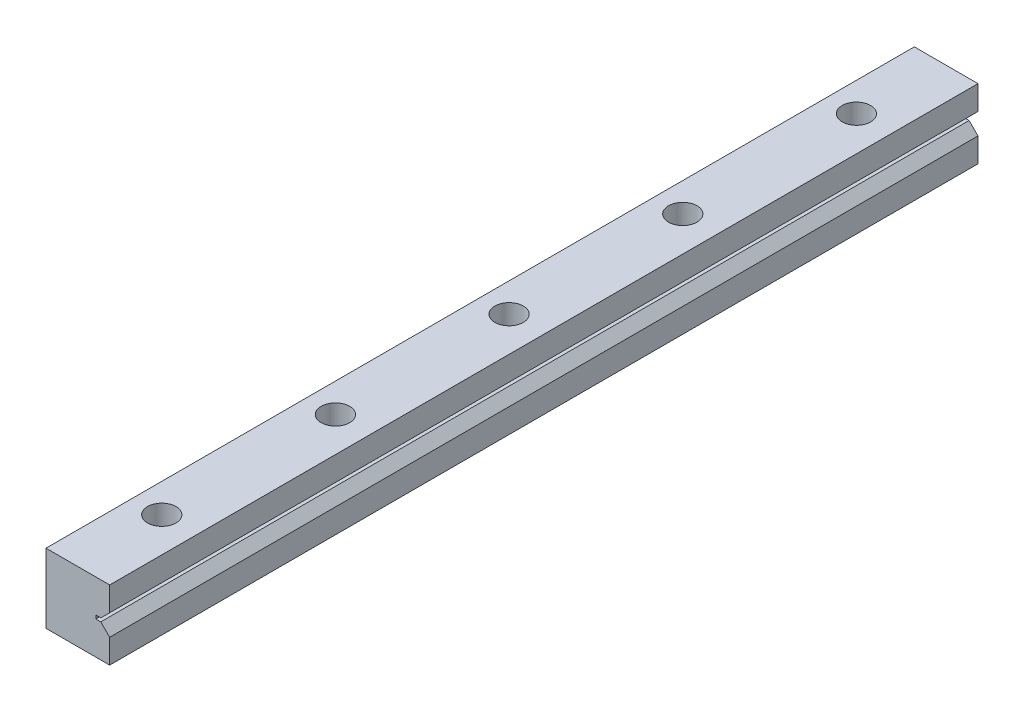
ISO-10303-21;
HEADER;
FILE_DESCRIPTION(('STEP AP214'),'2;1');
FILE_NAME('part.step','',(''),(''),'','','');
FILE_SCHEMA(('AUTOMOTIVE_DESIGN { 1 0 10303 214 1 1 1 1 }'));
ENDSEC;
DATA;
#1=APPLICATION_CONTEXT('core data for automotive mechanical design processes');
#2=APPLICATION_PROTOCOL_DEFINITION('international standard','automotive_design',2000,#1);
#3=PRODUCT_CONTEXT('',#1,'mechanical');
#4=PRODUCT('Part','Part','',(#3));
#5=PRODUCT_RELATED_PRODUCT_CATEGORY('part','',(#4));
#6=PRODUCT_DEFINITION_FORMATION('','',#4);
#7=PRODUCT_DEFINITION_CONTEXT('part definition',#1,'design');
#8=PRODUCT_DEFINITION('design','',#6,#7);
#9=PRODUCT_DEFINITION_SHAPE('','',#8);
#10=(LENGTH_UNIT() NAMED_UNIT(*) SI_UNIT(.MILLI.,.METRE.));
#11=(NAMED_UNIT(*) PLANE_ANGLE_UNIT() SI_UNIT($,.RADIAN.));
#12=(NAMED_UNIT(*) SI_UNIT($,.STERADIAN.) SOLID_ANGLE_UNIT());
#13=UNCERTAINTY_MEASURE_WITH_UNIT(LENGTH_MEASURE(1.E-05),#10,'distance_accuracy_value','');
#14=(GEOMETRIC_REPRESENTATION_CONTEXT(3) GLOBAL_UNCERTAINTY_ASSIGNED_CONTEXT((#13)) GLOBAL_UNIT_ASSIGNED_CONTEXT((#10,
#11,#12)) REPRESENTATION_CONTEXT('',''));
#15=CARTESIAN_POINT('',(0.,0.,0.));
#16=DIRECTION('',(0.,0.,1.));
#17=DIRECTION('',(1.,0.,0.));
#18=AXIS2_PLACEMENT_3D('',#15,#16,#17);
#19=CARTESIAN_POINT('',(-1.70000000000001,0.154630465789199,0.));
#20=DIRECTION('',(0.,1.,0.));
#21=DIRECTION('',(0.,0.,1.));
#22=AXIS2_PLACEMENT_3D('',#19,#20,#21);
#23=PLANE('',#22);
#24=DIRECTION('',(1.,0.,0.));
#25=VECTOR('',#24,1.);
#26=CARTESIAN_POINT('',(-1.70000000000001,0.154630465789199,75.));
#27=LINE('',#26,#25);
#28=CARTESIAN_POINT('',(-1.70000000000001,0.154630465789199,75.));
#29=VERTEX_POINT('',#28);
#30=CARTESIAN_POINT('',(-1.25958309658391,0.154630465789196,75.));
#31=VERTEX_POINT('',#30);
#32=EDGE_CURVE('E106',#29,#31,#27,.T.);
#33=ORIENTED_EDGE('',*,*,#32,.F.);
#34=DIRECTION('',(0.,0.,1.));
#35=VECTOR('',#34,1.);
#36=CARTESIAN_POINT('',(-1.70000000000001,0.154630465789199,0.));
#37=LINE('',#36,#35);
#38=CARTESIAN_POINT('',(-1.70000000000001,0.154630465789199,0.));
#39=VERTEX_POINT('',#38);
#40=EDGE_CURVE('E110',#29,#39,#37,.F.);
#41=ORIENTED_EDGE('',*,*,#40,.T.);
#42=DIRECTION('',(1.,0.,0.));
#43=VECTOR('',#42,1.);
#44=CARTESIAN_POINT('',(-1.70000000000001,0.154630465789199,0.));
#45=LINE('',#44,#43);
#46=CARTESIAN_POINT('',(-1.25958309658391,0.154630465789196,0.));
#47=VERTEX_POINT('',#46);
#48=EDGE_CURVE('E115',#47,#39,#45,.F.);
#49=ORIENTED_EDGE('',*,*,#48,.F.);
#50=DIRECTION('',(0.,0.,1.));
#51=VECTOR('',#50,1.);
#52=CARTESIAN_POINT('',(-1.2595830965839,0.154630465789186,0.));
#53=LINE('',#52,#51);
#54=EDGE_CURVE('E113',#47,#31,#53,.T.);
#55=ORIENTED_EDGE('',*,*,#54,.T.);
#56=EDGE_LOOP('',(#33,#41,#49,#55));
#57=FACE_BOUND('',#56,.T.);
#58=ADVANCED_FACE('F17',(#57),#23,.F.);
#59=CARTESIAN_POINT('',(-1.70000000000001,-0.14536953421082,0.));
#60=DIRECTION('',(-1.,0.,0.));
#61=DIRECTION('',(0.,0.,1.));
#62=AXIS2_PLACEMENT_3D('',#59,#60,#61);
#63=PLANE('',#62);
#64=DIRECTION('',(0.,0.,-1.));
#65=VECTOR('',#64,1.);
#66=CARTESIAN_POINT('',(-1.70000000000001,-0.145369534210795,0.));
#67=LINE('',#66,#65);
#68=CARTESIAN_POINT('',(-1.70000000000001,-0.145369534210814,75.));
#69=VERTEX_POINT('',#68);
#70=CARTESIAN_POINT('',(-1.70000000000001,-0.145369534210814,0.));
#71=VERTEX_POINT('',#70);
#72=EDGE_CURVE('E138',#69,#71,#67,.T.);
#73=ORIENTED_EDGE('',*,*,#72,.T.);
#74=DIRECTION('',(0.,1.,0.));
#75=VECTOR('',#74,1.);
#76=CARTESIAN_POINT('',(-1.70000000000001,-0.14536953421082,0.));
#77=LINE('',#76,#75);
#78=EDGE_CURVE('E125',#39,#71,#77,.F.);
#79=ORIENTED_EDGE('',*,*,#78,.F.);
#80=ORIENTED_EDGE('',*,*,#40,.F.);
#81=DIRECTION('',(0.,1.,0.));
#82=VECTOR('',#81,1.);
#83=CARTESIAN_POINT('',(-1.70000000000001,-0.14536953421082,75.));
#84=LINE('',#83,#82);
#85=EDGE_CURVE('E118',#69,#29,#84,.T.);
#86=ORIENTED_EDGE('',*,*,#85,.F.);
#87=EDGE_LOOP('',(#73,#79,#80,#86));
#88=FACE_BOUND('',#87,.T.);
#89=ADVANCED_FACE('F127',(#88),#63,.F.);
#90=CARTESIAN_POINT('',(-1.41421356237309,0.,0.));
#91=DIRECTION('',(-0.707106781186547,0.707106781186548,0.));
#92=DIRECTION('',(-0.707106781186548,-0.707106781186547,0.));
#93=AXIS2_PLACEMENT_3D('',#90,#91,#92);
#94=PLANE('',#93);
#95=DIRECTION('',(-0.707106781186548,-0.707106781186547,0.));
#96=VECTOR('',#95,1.);
#97=CARTESIAN_POINT('',(-1.41421356237309,0.,75.));
#98=LINE('',#97,#96);
#99=CARTESIAN_POINT('',(-0.5,0.914213562373098,75.));
#100=VERTEX_POINT('',#99);
#101=EDGE_CURVE('E131',#31,#100,#98,.F.);
#102=ORIENTED_EDGE('',*,*,#101,.F.);
#103=ORIENTED_EDGE('',*,*,#54,.F.);
#104=DIRECTION('',(-0.707106781186548,-0.707106781186547,0.));
#105=VECTOR('',#104,1.);
#106=CARTESIAN_POINT('',(-1.41421356237309,0.,0.));
#107=LINE('',#106,#105);
#108=CARTESIAN_POINT('',(-0.5,0.914213562373098,0.));
#109=VERTEX_POINT('',#108);
#110=EDGE_CURVE('E124',#109,#47,#107,.T.);
#111=ORIENTED_EDGE('',*,*,#110,.F.);
#112=DIRECTION('',(0.,0.,-1.));
#113=VECTOR('',#112,1.);
#114=CARTESIAN_POINT('',(-0.500000000000007,0.914213562373105,0.));
#115=LINE('',#114,#113);
#116=EDGE_CURVE('E137',#100,#109,#115,.T.);
#117=ORIENTED_EDGE('',*,*,#116,.F.);
#118=EDGE_LOOP('',(#102,#103,#111,#117));
#119=FACE_BOUND('',#118,.T.);
#120=ADVANCED_FACE('F472',(#119),#94,.F.);
#121=CARTESIAN_POINT('',(-0.500000000000007,-0.145369534210795,0.));
#122=DIRECTION('',(0.,-1.,0.));
#123=DIRECTION('',(0.,0.,-1.));
#124=AXIS2_PLACEMENT_3D('',#121,#122,#123);
#125=PLANE('',#124);
#126=DIRECTION('',(1.,0.,0.));
#127=VECTOR('',#126,1.);
#128=CARTESIAN_POINT('',(-0.500000000000007,-0.145369534210795,0.));
#129=LINE('',#128,#127);
#130=CARTESIAN_POINT('',(-1.26884402816229,-0.145369534210804,0.));
#131=VERTEX_POINT('',#130);
#132=EDGE_CURVE('E135',#71,#131,#129,.T.);
#133=ORIENTED_EDGE('',*,*,#132,.F.);
#134=ORIENTED_EDGE('',*,*,#72,.F.);
#135=DIRECTION('',(1.,0.,0.));
#136=VECTOR('',#135,1.);
#137=CARTESIAN_POINT('',(-0.500000000000007,-0.145369534210795,75.));
#138=LINE('',#137,#136);
#139=CARTESIAN_POINT('',(-1.26884402816229,-0.145369534210804,75.));
#140=VERTEX_POINT('',#139);
#141=EDGE_CURVE('E120',#140,#69,#138,.F.);
#142=ORIENTED_EDGE('',*,*,#141,.F.);
#143=DIRECTION('',(0.,0.,1.));
#144=VECTOR('',#143,1.);
#145=CARTESIAN_POINT('',(-1.26884402816228,-0.145369534210807,0.));
#146=LINE('',#145,#144);
#147=EDGE_CURVE('E146',#140,#131,#146,.F.);
#148=ORIENTED_EDGE('',*,*,#147,.T.);
#149=EDGE_LOOP('',(#133,#134,#142,#148));
#150=FACE_BOUND('',#149,.T.);
#151=ADVANCED_FACE('F246',(#150),#125,.F.);
#152=CARTESIAN_POINT('',(-3.5,-0.999999999999988,22.5));
#153=DIRECTION('',(0.,1.,0.));
#154=DIRECTION('',(0.,0.,1.));
#155=AXIS2_PLACEMENT_3D('',#152,#153,#154);
#156=CYLINDRICAL_SURFACE('',#155,1.22949999999999);
#157=CARTESIAN_POINT('',(-3.5,2.99999999999999,22.5));
#158=DIRECTION('',(0.,1.,0.));
#159=DIRECTION('',(0.,0.,1.));
#160=AXIS2_PLACEMENT_3D('',#157,#158,#159);
#161=CIRCLE('',#160,1.22949999999999);
#162=CARTESIAN_POINT('',(-3.5,2.99999999999999,23.7295));
#163=VERTEX_POINT('',#162);
#164=EDGE_CURVE('E21',#163,#163,#161,.F.);
#165=ORIENTED_EDGE('',*,*,#164,.F.);
#166=EDGE_LOOP('',(#165));
#167=FACE_BOUND('',#166,.T.);
#168=CARTESIAN_POINT('',(-3.5,-1.00000000000001,22.5));
#169=DIRECTION('',(0.,1.,0.));
#170=DIRECTION('',(0.,0.,1.));
#171=AXIS2_PLACEMENT_3D('',#168,#169,#170);
#172=CIRCLE('',#171,1.22949999999999);
#173=CARTESIAN_POINT('',(-3.5,-1.00000000000001,23.7295));
#174=VERTEX_POINT('',#173);
#175=EDGE_CURVE('E149',#174,#174,#172,.F.);
#176=ORIENTED_EDGE('',*,*,#175,.T.);
#177=EDGE_LOOP('',(#176));
#178=FACE_BOUND('',#177,.T.);
#179=ADVANCED_FACE('F242',(#167,#178),#156,.F.);
#180=CARTESIAN_POINT('',(-3.5,-0.999999999999988,37.5));
#181=DIRECTION('',(0.,1.,0.));
#182=DIRECTION('',(0.,0.,1.));
#183=AXIS2_PLACEMENT_3D('',#180,#181,#182);
#184=CYLINDRICAL_SURFACE('',#183,1.22950000000001);
#185=CARTESIAN_POINT('',(-3.5,2.99999999999999,37.5));
#186=DIRECTION('',(0.,1.,0.));
#187=DIRECTION('',(0.,0.,1.));
#188=AXIS2_PLACEMENT_3D('',#185,#186,#187);
#189=CIRCLE('',#188,1.22950000000001);
#190=CARTESIAN_POINT('',(-3.5,2.99999999999999,38.7295));
#191=VERTEX_POINT('',#190);
#192=EDGE_CURVE('E232',#191,#191,#189,.F.);
#193=ORIENTED_EDGE('',*,*,#192,.F.);
#194=EDGE_LOOP('',(#193));
#195=FACE_BOUND('',#194,.T.);
#196=CARTESIAN_POINT('',(-3.5,-1.00000000000001,37.5));
#197=DIRECTION('',(0.,1.,0.));
#198=DIRECTION('',(0.,0.,1.));
#199=AXIS2_PLACEMENT_3D('',#196,#197,#198);
#200=CIRCLE('',#199,1.22950000000001);
#201=CARTESIAN_POINT('',(-3.5,-1.00000000000001,38.7295));
#202=VERTEX_POINT('',#201);
#203=EDGE_CURVE('E220',#202,#202,#200,.F.);
#204=ORIENTED_EDGE('',*,*,#203,.T.);
#205=EDGE_LOOP('',(#204));
#206=FACE_BOUND('',#205,.T.);
#207=ADVANCED_FACE('F245',(#195,#206),#184,.F.);
#208=CARTESIAN_POINT('',(-3.5,-0.999999999999988,52.5));
#209=DIRECTION('',(0.,1.,0.));
#210=DIRECTION('',(0.,0.,1.));
#211=AXIS2_PLACEMENT_3D('',#208,#209,#210);
#212=CYLINDRICAL_SURFACE('',#211,1.22950000000001);
#213=CARTESIAN_POINT('',(-3.5,2.99999999999999,52.5));
#214=DIRECTION('',(0.,1.,0.));
#215=DIRECTION('',(0.,0.,1.));
#216=AXIS2_PLACEMENT_3D('',#213,#214,#215);
#217=CIRCLE('',#216,1.22950000000001);
#218=CARTESIAN_POINT('',(-3.5,2.99999999999999,53.7295));
#219=VERTEX_POINT('',#218);
#220=EDGE_CURVE('E230',#219,#219,#217,.F.);
#221=ORIENTED_EDGE('',*,*,#220,.F.);
#222=EDGE_LOOP('',(#221));
#223=FACE_BOUND('',#222,.T.);
#224=CARTESIAN_POINT('',(-3.5,-1.00000000000001,52.5));
#225=DIRECTION('',(0.,1.,0.));
#226=DIRECTION('',(0.,0.,1.));
#227=AXIS2_PLACEMENT_3D('',#224,#225,#226);
#228=CIRCLE('',#227,1.22950000000001);
#229=CARTESIAN_POINT('',(-3.5,-1.00000000000001,53.7295));
#230=VERTEX_POINT('',#229);
#231=EDGE_CURVE('E217',#230,#230,#228,.F.);
#232=ORIENTED_EDGE('',*,*,#231,.T.);
#233=EDGE_LOOP('',(#232));
#234=FACE_BOUND('',#233,.T.);
#235=ADVANCED_FACE('F291',(#223,#234),#212,.F.);
#236=CARTESIAN_POINT('',(-3.5,-0.999999999999988,7.5));
#237=DIRECTION('',(0.,1.,0.));
#238=DIRECTION('',(0.,0.,1.));
#239=AXIS2_PLACEMENT_3D('',#236,#237,#238);
#240=CYLINDRICAL_SURFACE('',#239,1.2295);
#241=CARTESIAN_POINT('',(-3.5,2.99999999999999,7.5));
#242=DIRECTION('',(0.,1.,0.));
#243=DIRECTION('',(0.,0.,1.));
#244=AXIS2_PLACEMENT_3D('',#241,#242,#243);
#245=CIRCLE('',#244,1.2295);
#246=CARTESIAN_POINT('',(-3.5,2.99999999999999,8.7295));
#247=VERTEX_POINT('',#246);
#248=EDGE_CURVE('E227',#247,#247,#245,.F.);
#249=ORIENTED_EDGE('',*,*,#248,.F.);
#250=EDGE_LOOP('',(#249));
#251=FACE_BOUND('',#250,.T.);
#252=CARTESIAN_POINT('',(-3.5,-1.00000000000001,7.5));
#253=DIRECTION('',(0.,1.,0.));
#254=DIRECTION('',(0.,0.,1.));
#255=AXIS2_PLACEMENT_3D('',#252,#253,#254);
#256=CIRCLE('',#255,1.2295);
#257=CARTESIAN_POINT('',(-3.5,-1.00000000000001,8.7295));
#258=VERTEX_POINT('',#257);
#259=EDGE_CURVE('E214',#258,#258,#256,.F.);
#260=ORIENTED_EDGE('',*,*,#259,.T.);
#261=EDGE_LOOP('',(#260));
#262=FACE_BOUND('',#261,.T.);
#263=ADVANCED_FACE('F295',(#251,#262),#240,.F.);
#264=CARTESIAN_POINT('',(-3.5,-0.999999999999988,67.5));
#265=DIRECTION('',(0.,1.,0.));
#266=DIRECTION('',(0.,0.,1.));
#267=AXIS2_PLACEMENT_3D('',#264,#265,#266);
#268=CYLINDRICAL_SURFACE('',#267,1.22949999999999);
#269=CARTESIAN_POINT('',(-3.5,2.99999999999999,67.5));
#270=DIRECTION('',(0.,1.,0.));
#271=DIRECTION('',(0.,0.,1.));
#272=AXIS2_PLACEMENT_3D('',#269,#270,#271);
#273=CIRCLE('',#272,1.22949999999999);
#274=CARTESIAN_POINT('',(-3.5,2.99999999999999,68.7295));
#275=VERTEX_POINT('',#274);
#276=EDGE_CURVE('E150',#275,#275,#273,.F.);
#277=ORIENTED_EDGE('',*,*,#276,.F.);
#278=EDGE_LOOP('',(#277));
#279=FACE_BOUND('',#278,.T.);
#280=CARTESIAN_POINT('',(-3.5,-1.00000000000001,67.5));
#281=DIRECTION('',(0.,1.,0.));
#282=DIRECTION('',(0.,0.,1.));
#283=AXIS2_PLACEMENT_3D('',#280,#281,#282);
#284=CIRCLE('',#283,1.22949999999999);
#285=CARTESIAN_POINT('',(-3.5,-1.00000000000001,68.7295));
#286=VERTEX_POINT('',#285);
#287=EDGE_CURVE('E158',#286,#286,#284,.F.);
#288=ORIENTED_EDGE('',*,*,#287,.T.);
#289=EDGE_LOOP('',(#288));
#290=FACE_BOUND('',#289,.T.);
#291=ADVANCED_FACE('F299',(#279,#290),#268,.F.);
#292=CARTESIAN_POINT('',(-0.500000000000007,0.154630465789199,0.));
#293=DIRECTION('',(1.,0.,0.));
#294=DIRECTION('',(0.,0.,-1.));
#295=AXIS2_PLACEMENT_3D('',#292,#293,#294);
#296=PLANE('',#295);
#297=DIRECTION('',(0.,0.,1.));
#298=VECTOR('',#297,1.);
#299=CARTESIAN_POINT('',(-0.500000000000007,2.99999999999999,0.));
#300=LINE('',#299,#298);
#301=CARTESIAN_POINT('',(-0.500000000000007,2.99999999999999,75.));
#302=VERTEX_POINT('',#301);
#303=CARTESIAN_POINT('',(-0.500000000000007,2.99999999999999,0.));
#304=VERTEX_POINT('',#303);
#305=EDGE_CURVE('E143',#302,#304,#300,.F.);
#306=ORIENTED_EDGE('',*,*,#305,.F.);
#307=DIRECTION('',(0.,1.,0.));
#308=VECTOR('',#307,1.);
#309=CARTESIAN_POINT('',(-0.500000000000007,0.,75.));
#310=LINE('',#309,#308);
#311=EDGE_CURVE('E154',#100,#302,#310,.T.);
#312=ORIENTED_EDGE('',*,*,#311,.F.);
#313=ORIENTED_EDGE('',*,*,#116,.T.);
#314=DIRECTION('',(0.,1.,0.));
#315=VECTOR('',#314,1.);
#316=CARTESIAN_POINT('',(-0.500000000000007,0.,0.));
#317=LINE('',#316,#315);
#318=EDGE_CURVE('E162',#109,#304,#317,.T.);
#319=ORIENTED_EDGE('',*,*,#318,.T.);
#320=EDGE_LOOP('',(#306,#312,#313,#319));
#321=FACE_BOUND('',#320,.T.);
#322=ADVANCED_FACE('F302',(#321),#296,.T.);
#323=CARTESIAN_POINT('',(-6.,2.99999999999999,0.));
#324=DIRECTION('',(0.,1.,0.));
#325=DIRECTION('',(0.,0.,1.));
#326=AXIS2_PLACEMENT_3D('',#323,#324,#325);
#327=PLANE('',#326);
#328=ORIENTED_EDGE('',*,*,#276,.T.);
#329=EDGE_LOOP('',(#328));
#330=FACE_BOUND('',#329,.T.);
#331=ORIENTED_EDGE('',*,*,#248,.T.);
#332=EDGE_LOOP('',(#331));
#333=FACE_BOUND('',#332,.T.);
#334=ORIENTED_EDGE('',*,*,#220,.T.);
#335=EDGE_LOOP('',(#334));
#336=FACE_BOUND('',#335,.T.);
#337=ORIENTED_EDGE('',*,*,#192,.T.);
#338=EDGE_LOOP('',(#337));
#339=FACE_BOUND('',#338,.T.);
#340=ORIENTED_EDGE('',*,*,#164,.T.);
#341=EDGE_LOOP('',(#340));
#342=FACE_BOUND('',#341,.T.);
#343=DIRECTION('',(1.,0.,0.));
#344=VECTOR('',#343,1.);
#345=CARTESIAN_POINT('',(-3.25,2.99999999999999,0.));
#346=LINE('',#345,#344);
#347=CARTESIAN_POINT('',(-6.,2.99999999999999,0.));
#348=VERTEX_POINT('',#347);
#349=EDGE_CURVE('E169',#304,#348,#346,.F.);
#350=ORIENTED_EDGE('',*,*,#349,.T.);
#351=DIRECTION('',(0.,0.,1.));
#352=VECTOR('',#351,1.);
#353=CARTESIAN_POINT('',(-6.,2.99999999999999,0.));
#354=LINE('',#353,#352);
#355=CARTESIAN_POINT('',(-6.,2.99999999999999,75.));
#356=VERTEX_POINT('',#355);
#357=EDGE_CURVE('E159',#356,#348,#354,.F.);
#358=ORIENTED_EDGE('',*,*,#357,.F.);
#359=DIRECTION('',(1.,0.,0.));
#360=VECTOR('',#359,1.);
#361=CARTESIAN_POINT('',(-3.25,2.99999999999999,75.));
#362=LINE('',#361,#360);
#363=EDGE_CURVE('E151',#302,#356,#362,.F.);
#364=ORIENTED_EDGE('',*,*,#363,.F.);
#365=ORIENTED_EDGE('',*,*,#305,.T.);
#366=EDGE_LOOP('',(#350,#358,#364,#365));
#367=FACE_BOUND('',#366,.T.);
#368=ADVANCED_FACE('F239',(#330,#333,#336,#339,#342,#367),#327,.T.);
#369=CARTESIAN_POINT('',(0.,-1.41421356237309,0.));
#370=DIRECTION('',(-0.707106781186548,-0.707106781186548,0.));
#371=DIRECTION('',(0.707106781186548,-0.707106781186548,0.));
#372=AXIS2_PLACEMENT_3D('',#369,#370,#371);
#373=PLANE('',#372);
#374=DIRECTION('',(-0.707106781186548,0.707106781186547,0.));
#375=VECTOR('',#374,1.);
#376=CARTESIAN_POINT('',(-0.500000000000007,-0.914213562373105,75.));
#377=LINE('',#376,#375);
#378=CARTESIAN_POINT('',(-0.5,-0.914213562373098,75.));
#379=VERTEX_POINT('',#378);
#380=EDGE_CURVE('E57',#379,#140,#377,.T.);
#381=ORIENTED_EDGE('',*,*,#380,.F.);
#382=DIRECTION('',(0.,0.,-1.));
#383=VECTOR('',#382,1.);
#384=CARTESIAN_POINT('',(-0.500000000000007,-0.914213562373105,0.));
#385=LINE('',#384,#383);
#386=CARTESIAN_POINT('',(-0.5,-0.914213562373098,0.));
#387=VERTEX_POINT('',#386);
#388=EDGE_CURVE('E61',#387,#379,#385,.F.);
#389=ORIENTED_EDGE('',*,*,#388,.F.);
#390=DIRECTION('',(-0.707106781186548,0.707106781186547,0.));
#391=VECTOR('',#390,1.);
#392=CARTESIAN_POINT('',(-0.500000000000007,-0.914213562373105,0.));
#393=LINE('',#392,#391);
#394=EDGE_CURVE('E165',#387,#131,#393,.T.);
#395=ORIENTED_EDGE('',*,*,#394,.T.);
#396=ORIENTED_EDGE('',*,*,#147,.F.);
#397=EDGE_LOOP('',(#381,#389,#395,#396));
#398=FACE_BOUND('',#397,.T.);
#399=ADVANCED_FACE('F254',(#398),#373,.F.);
#400=CARTESIAN_POINT('',(-5.70000000000001,-1.00000000000001,24.744));
#401=DIRECTION('',(0.,1.,0.));
#402=DIRECTION('',(1.,0.,0.));
#403=AXIS2_PLACEMENT_3D('',#400,#401,#402);
#404=PLANE('',#403);
#405=ORIENTED_EDGE('',*,*,#175,.F.);
#406=EDGE_LOOP('',(#405));
#407=FACE_BOUND('',#406,.T.);
#408=CARTESIAN_POINT('',(-3.5,-1.00000000000001,22.5));
#409=DIRECTION('',(0.,1.,0.));
#410=DIRECTION('',(0.,0.,1.));
#411=AXIS2_PLACEMENT_3D('',#408,#409,#410);
#412=CIRCLE('',#411,2.2);
#413=CARTESIAN_POINT('',(-3.5,-1.00000000000001,24.7));
#414=VERTEX_POINT('',#413);
#415=EDGE_CURVE('E173',#414,#414,#412,.F.);
#416=ORIENTED_EDGE('',*,*,#415,.T.);
#417=EDGE_LOOP('',(#416));
#418=FACE_BOUND('',#417,.T.);
#419=ADVANCED_FACE('F250',(#407,#418),#404,.F.);
#420=CARTESIAN_POINT('',(-5.70000000000001,-1.00000000000001,39.744));
#421=DIRECTION('',(0.,1.,0.));
#422=DIRECTION('',(1.,0.,0.));
#423=AXIS2_PLACEMENT_3D('',#420,#421,#422);
#424=PLANE('',#423);
#425=ORIENTED_EDGE('',*,*,#203,.F.);
#426=EDGE_LOOP('',(#425));
#427=FACE_BOUND('',#426,.T.);
#428=CARTESIAN_POINT('',(-3.5,-1.00000000000001,37.5));
#429=DIRECTION('',(0.,1.,0.));
#430=DIRECTION('',(0.,0.,1.));
#431=AXIS2_PLACEMENT_3D('',#428,#429,#430);
#432=CIRCLE('',#431,2.20000000000001);
#433=CARTESIAN_POINT('',(-3.5,-1.00000000000001,39.7));
#434=VERTEX_POINT('',#433);
#435=EDGE_CURVE('E207',#434,#434,#432,.F.);
#436=ORIENTED_EDGE('',*,*,#435,.T.);
#437=EDGE_LOOP('',(#436));
#438=FACE_BOUND('',#437,.T.);
#439=ADVANCED_FACE('F253',(#427,#438),#424,.F.);
#440=CARTESIAN_POINT('',(-5.70000000000001,-1.00000000000001,54.744));
#441=DIRECTION('',(0.,1.,0.));
#442=DIRECTION('',(1.,0.,0.));
#443=AXIS2_PLACEMENT_3D('',#440,#441,#442);
#444=PLANE('',#443);
#445=ORIENTED_EDGE('',*,*,#231,.F.);
#446=EDGE_LOOP('',(#445));
#447=FACE_BOUND('',#446,.T.);
#448=CARTESIAN_POINT('',(-3.5,-1.00000000000001,52.5));
#449=DIRECTION('',(0.,1.,0.));
#450=DIRECTION('',(0.,0.,1.));
#451=AXIS2_PLACEMENT_3D('',#448,#449,#450);
#452=CIRCLE('',#451,2.2);
#453=CARTESIAN_POINT('',(-3.5,-1.00000000000001,54.7));
#454=VERTEX_POINT('',#453);
#455=EDGE_CURVE('E204',#454,#454,#452,.F.);
#456=ORIENTED_EDGE('',*,*,#455,.T.);
#457=EDGE_LOOP('',(#456));
#458=FACE_BOUND('',#457,.T.);
#459=ADVANCED_FACE('F307',(#447,#458),#444,.F.);
#460=CARTESIAN_POINT('',(-5.70000000000001,-1.00000000000001,9.74400000000001));
#461=DIRECTION('',(0.,1.,0.));
#462=DIRECTION('',(1.,0.,0.));
#463=AXIS2_PLACEMENT_3D('',#460,#461,#462);
#464=PLANE('',#463);
#465=ORIENTED_EDGE('',*,*,#259,.F.);
#466=EDGE_LOOP('',(#465));
#467=FACE_BOUND('',#466,.T.);
#468=CARTESIAN_POINT('',(-3.5,-1.00000000000001,7.5));
#469=DIRECTION('',(0.,1.,0.));
#470=DIRECTION('',(0.,0.,1.));
#471=AXIS2_PLACEMENT_3D('',#468,#469,#470);
#472=CIRCLE('',#471,2.2);
#473=CARTESIAN_POINT('',(-3.5,-1.00000000000001,9.7));
#474=VERTEX_POINT('',#473);
#475=EDGE_CURVE('E201',#474,#474,#472,.F.);
#476=ORIENTED_EDGE('',*,*,#475,.T.);
#477=EDGE_LOOP('',(#476));
#478=FACE_BOUND('',#477,.T.);
#479=ADVANCED_FACE('F311',(#467,#478),#464,.F.);
#480=CARTESIAN_POINT('',(-5.70000000000001,-1.00000000000001,69.744));
#481=DIRECTION('',(0.,1.,0.));
#482=DIRECTION('',(1.,0.,0.));
#483=AXIS2_PLACEMENT_3D('',#480,#481,#482);
#484=PLANE('',#483);
#485=ORIENTED_EDGE('',*,*,#287,.F.);
#486=EDGE_LOOP('',(#485));
#487=FACE_BOUND('',#486,.T.);
#488=CARTESIAN_POINT('',(-3.49999999999998,-1.00000000000001,67.5));
#489=DIRECTION('',(0.,1.,0.));
#490=DIRECTION('',(0.,0.,1.));
#491=AXIS2_PLACEMENT_3D('',#488,#489,#490);
#492=CIRCLE('',#491,2.20000000000001);
#493=CARTESIAN_POINT('',(-3.49999999999998,-1.00000000000001,69.7));
#494=VERTEX_POINT('',#493);
#495=EDGE_CURVE('E187',#494,#494,#492,.F.);
#496=ORIENTED_EDGE('',*,*,#495,.T.);
#497=EDGE_LOOP('',(#496));
#498=FACE_BOUND('',#497,.T.);
#499=ADVANCED_FACE('F314',(#487,#498),#484,.F.);
#500=CARTESIAN_POINT('',(-3.25,0.,75.));
#501=DIRECTION('',(0.,0.,1.));
#502=DIRECTION('',(1.,0.,0.));
#503=AXIS2_PLACEMENT_3D('',#500,#501,#502);
#504=PLANE('',#503);
#505=DIRECTION('',(1.,0.,0.));
#506=VECTOR('',#505,1.);
#507=CARTESIAN_POINT('',(-0.500000000000007,-2.99999999999999,75.));
#508=LINE('',#507,#506);
#509=CARTESIAN_POINT('',(-0.500000000000007,-3.,75.));
#510=VERTEX_POINT('',#509);
#511=CARTESIAN_POINT('',(-6.,-3.00000000000001,75.));
#512=VERTEX_POINT('',#511);
#513=EDGE_CURVE('E49',#510,#512,#508,.F.);
#514=ORIENTED_EDGE('',*,*,#513,.F.);
#515=DIRECTION('',(0.,1.,0.));
#516=VECTOR('',#515,1.);
#517=CARTESIAN_POINT('',(-0.500000000000007,0.154630465789199,75.));
#518=LINE('',#517,#516);
#519=EDGE_CURVE('E174',#379,#510,#518,.F.);
#520=ORIENTED_EDGE('',*,*,#519,.F.);
#521=ORIENTED_EDGE('',*,*,#380,.T.);
#522=ORIENTED_EDGE('',*,*,#141,.T.);
#523=ORIENTED_EDGE('',*,*,#85,.T.);
#524=ORIENTED_EDGE('',*,*,#32,.T.);
#525=ORIENTED_EDGE('',*,*,#101,.T.);
#526=ORIENTED_EDGE('',*,*,#311,.T.);
#527=ORIENTED_EDGE('',*,*,#363,.T.);
#528=DIRECTION('',(0.,1.,0.));
#529=VECTOR('',#528,1.);
#530=CARTESIAN_POINT('',(-6.,-3.00000000000001,75.));
#531=LINE('',#530,#529);
#532=EDGE_CURVE('E153',#512,#356,#531,.T.);
#533=ORIENTED_EDGE('',*,*,#532,.F.);
#534=EDGE_LOOP('',(#514,#520,#521,#522,#523,#524,#525,#526,#527,#533));
#535=FACE_BOUND('',#534,.T.);
#536=ADVANCED_FACE('F119',(#535),#504,.T.);
#537=CARTESIAN_POINT('',(-6.,-3.00000000000001,0.));
#538=DIRECTION('',(-1.,0.,0.));
#539=DIRECTION('',(0.,0.,1.));
#540=AXIS2_PLACEMENT_3D('',#537,#538,#539);
#541=PLANE('',#540);
#542=DIRECTION('',(0.,1.,0.));
#543=VECTOR('',#542,1.);
#544=CARTESIAN_POINT('',(-6.,0.,0.));
#545=LINE('',#544,#543);
#546=CARTESIAN_POINT('',(-6.,-3.00000000000001,0.));
#547=VERTEX_POINT('',#546);
#548=EDGE_CURVE('E167',#348,#547,#545,.F.);
#549=ORIENTED_EDGE('',*,*,#548,.T.);
#550=DIRECTION('',(0.,0.,-1.));
#551=VECTOR('',#550,1.);
#552=CARTESIAN_POINT('',(-6.,-2.99999999999999,0.));
#553=LINE('',#552,#551);
#554=EDGE_CURVE('E184',#512,#547,#553,.T.);
#555=ORIENTED_EDGE('',*,*,#554,.F.);
#556=ORIENTED_EDGE('',*,*,#532,.T.);
#557=ORIENTED_EDGE('',*,*,#357,.T.);
#558=EDGE_LOOP('',(#549,#555,#556,#557));
#559=FACE_BOUND('',#558,.T.);
#560=ADVANCED_FACE('F321',(#559),#541,.T.);
#561=CARTESIAN_POINT('',(-3.25,0.,0.));
#562=DIRECTION('',(0.,0.,1.));
#563=DIRECTION('',(1.,0.,0.));
#564=AXIS2_PLACEMENT_3D('',#561,#562,#563);
#565=PLANE('',#564);
#566=DIRECTION('',(0.,1.,0.));
#567=VECTOR('',#566,1.);
#568=CARTESIAN_POINT('',(-0.500000000000007,0.154630465789199,0.));
#569=LINE('',#568,#567);
#570=CARTESIAN_POINT('',(-0.500000000000007,-3.,0.));
#571=VERTEX_POINT('',#570);
#572=EDGE_CURVE('E36',#571,#387,#569,.T.);
#573=ORIENTED_EDGE('',*,*,#572,.F.);
#574=DIRECTION('',(1.,0.,0.));
#575=VECTOR('',#574,1.);
#576=CARTESIAN_POINT('',(-0.500000000000007,-2.99999999999999,0.));
#577=LINE('',#576,#575);
#578=EDGE_CURVE('E181',#547,#571,#577,.T.);
#579=ORIENTED_EDGE('',*,*,#578,.F.);
#580=ORIENTED_EDGE('',*,*,#548,.F.);
#581=ORIENTED_EDGE('',*,*,#349,.F.);
#582=ORIENTED_EDGE('',*,*,#318,.F.);
#583=ORIENTED_EDGE('',*,*,#110,.T.);
#584=ORIENTED_EDGE('',*,*,#48,.T.);
#585=ORIENTED_EDGE('',*,*,#78,.T.);
#586=ORIENTED_EDGE('',*,*,#132,.T.);
#587=ORIENTED_EDGE('',*,*,#394,.F.);
#588=EDGE_LOOP('',(#573,#579,#580,#581,#582,#583,#584,#585,#586,#587));
#589=FACE_BOUND('',#588,.T.);
#590=ADVANCED_FACE('F272',(#589),#565,.F.);
#591=CARTESIAN_POINT('',(-0.500000000000007,0.154630465789199,0.));
#592=DIRECTION('',(1.,0.,0.));
#593=DIRECTION('',(0.,0.,-1.));
#594=AXIS2_PLACEMENT_3D('',#591,#592,#593);
#595=PLANE('',#594);
#596=DIRECTION('',(0.,0.,-1.));
#597=VECTOR('',#596,1.);
#598=CARTESIAN_POINT('',(-0.500000000000007,-2.99999999999999,0.));
#599=LINE('',#598,#597);
#600=EDGE_CURVE('E177',#571,#510,#599,.F.);
#601=ORIENTED_EDGE('',*,*,#600,.F.);
#602=ORIENTED_EDGE('',*,*,#572,.T.);
#603=ORIENTED_EDGE('',*,*,#388,.T.);
#604=ORIENTED_EDGE('',*,*,#519,.T.);
#605=EDGE_LOOP('',(#601,#602,#603,#604));
#606=FACE_BOUND('',#605,.T.);
#607=ADVANCED_FACE('F261',(#606),#595,.T.);
#608=CARTESIAN_POINT('',(-3.5,-3.00000000000001,22.5));
#609=DIRECTION('',(0.,1.,0.));
#610=DIRECTION('',(0.,0.,1.));
#611=AXIS2_PLACEMENT_3D('',#608,#609,#610);
#612=CYLINDRICAL_SURFACE('',#611,2.2);
#613=CARTESIAN_POINT('',(-3.5,-2.99999999999999,22.5));
#614=DIRECTION('',(0.,1.,0.));
#615=DIRECTION('',(0.,0.,1.));
#616=AXIS2_PLACEMENT_3D('',#613,#614,#615);
#617=CIRCLE('',#616,2.2);
#618=CARTESIAN_POINT('',(-3.5,-2.99999999999999,24.7));
#619=VERTEX_POINT('',#618);
#620=EDGE_CURVE('E180',#619,#619,#617,.T.);
#621=ORIENTED_EDGE('',*,*,#620,.F.);
#622=EDGE_LOOP('',(#621));
#623=FACE_BOUND('',#622,.T.);
#624=ORIENTED_EDGE('',*,*,#415,.F.);
#625=EDGE_LOOP('',(#624));
#626=FACE_BOUND('',#625,.T.);
#627=ADVANCED_FACE('F258',(#623,#626),#612,.F.);
#628=CARTESIAN_POINT('',(-3.5,-3.00000000000001,37.5));
#629=DIRECTION('',(0.,1.,0.));
#630=DIRECTION('',(0.,0.,1.));
#631=AXIS2_PLACEMENT_3D('',#628,#629,#630);
#632=CYLINDRICAL_SURFACE('',#631,2.20000000000001);
#633=CARTESIAN_POINT('',(-3.5,-2.99999999999999,37.5));
#634=DIRECTION('',(0.,1.,0.));
#635=DIRECTION('',(0.,0.,1.));
#636=AXIS2_PLACEMENT_3D('',#633,#634,#635);
#637=CIRCLE('',#636,2.20000000000001);
#638=CARTESIAN_POINT('',(-3.5,-2.99999999999999,39.7));
#639=VERTEX_POINT('',#638);
#640=EDGE_CURVE('E194',#639,#639,#637,.T.);
#641=ORIENTED_EDGE('',*,*,#640,.F.);
#642=EDGE_LOOP('',(#641));
#643=FACE_BOUND('',#642,.T.);
#644=ORIENTED_EDGE('',*,*,#435,.F.);
#645=EDGE_LOOP('',(#644));
#646=FACE_BOUND('',#645,.T.);
#647=ADVANCED_FACE('F260',(#643,#646),#632,.F.);
#648=CARTESIAN_POINT('',(-3.5,-3.00000000000001,52.5));
#649=DIRECTION('',(0.,1.,0.));
#650=DIRECTION('',(0.,0.,1.));
#651=AXIS2_PLACEMENT_3D('',#648,#649,#650);
#652=CYLINDRICAL_SURFACE('',#651,2.2);
#653=CARTESIAN_POINT('',(-3.5,-2.99999999999999,52.5));
#654=DIRECTION('',(0.,1.,0.));
#655=DIRECTION('',(0.,0.,1.));
#656=AXIS2_PLACEMENT_3D('',#653,#654,#655);
#657=CIRCLE('',#656,2.2);
#658=CARTESIAN_POINT('',(-3.5,-2.99999999999999,54.7));
#659=VERTEX_POINT('',#658);
#660=EDGE_CURVE('E191',#659,#659,#657,.T.);
#661=ORIENTED_EDGE('',*,*,#660,.F.);
#662=EDGE_LOOP('',(#661));
#663=FACE_BOUND('',#662,.T.);
#664=ORIENTED_EDGE('',*,*,#455,.F.);
#665=EDGE_LOOP('',(#664));
#666=FACE_BOUND('',#665,.T.);
#667=ADVANCED_FACE('F269',(#663,#666),#652,.F.);
#668=CARTESIAN_POINT('',(-3.5,-3.00000000000001,7.5));
#669=DIRECTION('',(0.,1.,0.));
#670=DIRECTION('',(0.,0.,1.));
#671=AXIS2_PLACEMENT_3D('',#668,#669,#670);
#672=CYLINDRICAL_SURFACE('',#671,2.2);
#673=CARTESIAN_POINT('',(-3.5,-2.99999999999999,7.5));
#674=DIRECTION('',(0.,1.,0.));
#675=DIRECTION('',(0.,0.,1.));
#676=AXIS2_PLACEMENT_3D('',#673,#674,#675);
#677=CIRCLE('',#676,2.2);
#678=CARTESIAN_POINT('',(-3.5,-2.99999999999999,9.7));
#679=VERTEX_POINT('',#678);
#680=EDGE_CURVE('E27',#679,#679,#677,.T.);
#681=ORIENTED_EDGE('',*,*,#680,.F.);
#682=EDGE_LOOP('',(#681));
#683=FACE_BOUND('',#682,.T.);
#684=ORIENTED_EDGE('',*,*,#475,.F.);
#685=EDGE_LOOP('',(#684));
#686=FACE_BOUND('',#685,.T.);
#687=ADVANCED_FACE('F284',(#683,#686),#672,.F.);
#688=CARTESIAN_POINT('',(-3.49999999999998,-3.00000000000001,67.5));
#689=DIRECTION('',(0.,1.,0.));
#690=DIRECTION('',(0.,0.,1.));
#691=AXIS2_PLACEMENT_3D('',#688,#689,#690);
#692=CYLINDRICAL_SURFACE('',#691,2.20000000000001);
#693=CARTESIAN_POINT('',(-3.49999999999998,-2.99999999999999,67.5));
#694=DIRECTION('',(0.,1.,0.));
#695=DIRECTION('',(0.,0.,1.));
#696=AXIS2_PLACEMENT_3D('',#693,#694,#695);
#697=CIRCLE('',#696,2.20000000000001);
#698=CARTESIAN_POINT('',(-3.49999999999998,-2.99999999999999,69.7));
#699=VERTEX_POINT('',#698);
#700=EDGE_CURVE('E11',#699,#699,#697,.T.);
#701=ORIENTED_EDGE('',*,*,#700,.F.);
#702=EDGE_LOOP('',(#701));
#703=FACE_BOUND('',#702,.T.);
#704=ORIENTED_EDGE('',*,*,#495,.F.);
#705=EDGE_LOOP('',(#704));
#706=FACE_BOUND('',#705,.T.);
#707=ADVANCED_FACE('F19',(#703,#706),#692,.F.);
#708=CARTESIAN_POINT('',(-0.500000000000007,-2.99999999999999,0.));
#709=DIRECTION('',(0.,-1.,0.));
#710=DIRECTION('',(0.,0.,-1.));
#711=AXIS2_PLACEMENT_3D('',#708,#709,#710);
#712=PLANE('',#711);
#713=ORIENTED_EDGE('',*,*,#700,.T.);
#714=EDGE_LOOP('',(#713));
#715=FACE_BOUND('',#714,.T.);
#716=ORIENTED_EDGE('',*,*,#680,.T.);
#717=EDGE_LOOP('',(#716));
#718=FACE_BOUND('',#717,.T.);
#719=ORIENTED_EDGE('',*,*,#660,.T.);
#720=EDGE_LOOP('',(#719));
#721=FACE_BOUND('',#720,.T.);
#722=ORIENTED_EDGE('',*,*,#640,.T.);
#723=EDGE_LOOP('',(#722));
#724=FACE_BOUND('',#723,.T.);
#725=ORIENTED_EDGE('',*,*,#620,.T.);
#726=EDGE_LOOP('',(#725));
#727=FACE_BOUND('',#726,.T.);
#728=ORIENTED_EDGE('',*,*,#578,.T.);
#729=ORIENTED_EDGE('',*,*,#600,.T.);
#730=ORIENTED_EDGE('',*,*,#513,.T.);
#731=ORIENTED_EDGE('',*,*,#554,.T.);
#732=EDGE_LOOP('',(#728,#729,#730,#731));
#733=FACE_BOUND('',#732,.T.);
#734=ADVANCED_FACE('F277',(#715,#718,#721,#724,#727,#733),#712,.T.);
#735=CLOSED_SHELL('',(#58,#89,#120,#151,#179,#207,#235,#263,#291,#322,#368,#399,#419,#439,#459,
#479,#499,#536,#560,#590,#607,#627,#647,#667,#687,#707,#734));
#736=MANIFOLD_SOLID_BREP('B1',#735);
#737=ADVANCED_BREP_SHAPE_REPRESENTATION('',(#18,#736),#14);
#738=SHAPE_DEFINITION_REPRESENTATION(#9,#737);
ENDSEC;
END-ISO-10303-21;
